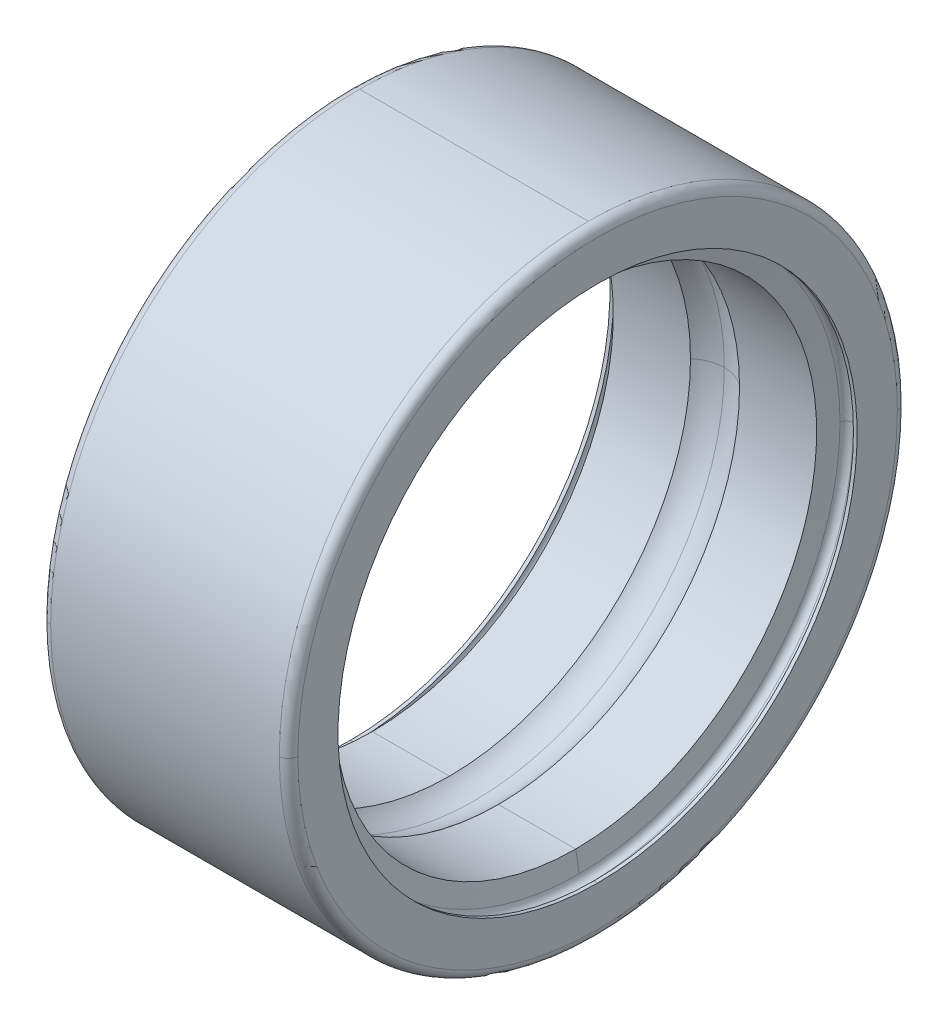
ISO-10303-21;
HEADER;
FILE_DESCRIPTION(('STEP AP214'),'2;1');
FILE_NAME('part.step','',(''),(''),'','','');
FILE_SCHEMA(('AUTOMOTIVE_DESIGN { 1 0 10303 214 1 1 1 1 }'));
ENDSEC;
DATA;
#1=APPLICATION_CONTEXT('core data for automotive mechanical design processes');
#2=APPLICATION_PROTOCOL_DEFINITION('international standard','automotive_design',2000,#1);
#3=PRODUCT_CONTEXT('',#1,'mechanical');
#4=PRODUCT('Part','Part','',(#3));
#5=PRODUCT_RELATED_PRODUCT_CATEGORY('part','',(#4));
#6=PRODUCT_DEFINITION_FORMATION('','',#4);
#7=PRODUCT_DEFINITION_CONTEXT('part definition',#1,'design');
#8=PRODUCT_DEFINITION('design','',#6,#7);
#9=PRODUCT_DEFINITION_SHAPE('','',#8);
#10=(LENGTH_UNIT() NAMED_UNIT(*) SI_UNIT(.MILLI.,.METRE.));
#11=(NAMED_UNIT(*) PLANE_ANGLE_UNIT() SI_UNIT($,.RADIAN.));
#12=(NAMED_UNIT(*) SI_UNIT($,.STERADIAN.) SOLID_ANGLE_UNIT());
#13=UNCERTAINTY_MEASURE_WITH_UNIT(LENGTH_MEASURE(1.E-05),#10,'distance_accuracy_value','');
#14=(GEOMETRIC_REPRESENTATION_CONTEXT(3) GLOBAL_UNCERTAINTY_ASSIGNED_CONTEXT((#13)) GLOBAL_UNIT_ASSIGNED_CONTEXT((#10,
#11,#12)) REPRESENTATION_CONTEXT('',''));
#15=CARTESIAN_POINT('',(0.,0.,0.));
#16=DIRECTION('',(0.,0.,1.));
#17=DIRECTION('',(1.,0.,0.));
#18=AXIS2_PLACEMENT_3D('',#15,#16,#17);
#19=CARTESIAN_POINT('',(3.82,0.,0.));
#20=DIRECTION('',(1.,0.,0.));
#21=DIRECTION('',(0.,0.,-1.));
#22=AXIS2_PLACEMENT_3D('',#19,#20,#21);
#23=TOROIDAL_SURFACE('',#22,4.2,0.12);
#24=CARTESIAN_POINT('',(3.82,0.,0.));
#25=DIRECTION('',(1.,0.,0.));
#26=DIRECTION('',(0.,0.,1.));
#27=AXIS2_PLACEMENT_3D('',#24,#25,#26);
#28=CIRCLE('',#27,4.32);
#29=CARTESIAN_POINT('',(3.82,0.,-4.32));
#30=VERTEX_POINT('',#29);
#31=CARTESIAN_POINT('',(3.82,0.,4.32));
#32=VERTEX_POINT('',#31);
#33=EDGE_CURVE('E184',#30,#32,#28,.T.);
#34=ORIENTED_EDGE('',*,*,#33,.T.);
#35=CARTESIAN_POINT('',(3.82,0.,4.2));
#36=DIRECTION('',(0.,-1.,0.));
#37=DIRECTION('',(0.,0.,1.));
#38=AXIS2_PLACEMENT_3D('',#35,#36,#37);
#39=CIRCLE('',#38,0.12);
#40=CARTESIAN_POINT('',(3.70182306963854,0.,4.22083778132003));
#41=VERTEX_POINT('',#40);
#42=EDGE_CURVE('E197',#32,#41,#39,.T.);
#43=ORIENTED_EDGE('',*,*,#42,.T.);
#44=CARTESIAN_POINT('',(3.70182306963853,0.,0.));
#45=DIRECTION('',(1.,0.,0.));
#46=DIRECTION('',(0.,1.,0.));
#47=AXIS2_PLACEMENT_3D('',#44,#45,#46);
#48=CIRCLE('',#47,4.22083778132003);
#49=CARTESIAN_POINT('',(3.70182306963853,4.22083778132003,0.));
#50=VERTEX_POINT('',#49);
#51=EDGE_CURVE('E31',#50,#41,#48,.T.);
#52=ORIENTED_EDGE('',*,*,#51,.F.);
#53=CARTESIAN_POINT('',(3.70182306963853,0.,0.));
#54=DIRECTION('',(1.,0.,0.));
#55=DIRECTION('',(0.,1.,0.));
#56=AXIS2_PLACEMENT_3D('',#53,#54,#55);
#57=CIRCLE('',#56,4.22083778132003);
#58=CARTESIAN_POINT('',(3.70182306963854,0.,-4.22083778132003));
#59=VERTEX_POINT('',#58);
#60=EDGE_CURVE('E185',#59,#50,#57,.T.);
#61=ORIENTED_EDGE('',*,*,#60,.F.);
#62=CARTESIAN_POINT('',(3.82,0.,-4.2));
#63=DIRECTION('',(0.,-1.,0.));
#64=DIRECTION('',(0.,0.,-1.));
#65=AXIS2_PLACEMENT_3D('',#62,#63,#64);
#66=CIRCLE('',#65,0.12);
#67=EDGE_CURVE('E181',#59,#30,#66,.T.);
#68=ORIENTED_EDGE('',*,*,#67,.T.);
#69=EDGE_LOOP('',(#34,#43,#52,#61,#68));
#70=FACE_BOUND('',#69,.T.);
#71=ADVANCED_FACE('F16',(#70),#23,.F.);
#72=CARTESIAN_POINT('',(3.97,0.,0.));
#73=DIRECTION('',(1.,0.,0.));
#74=DIRECTION('',(0.,1.,0.));
#75=AXIS2_PLACEMENT_3D('',#72,#73,#74);
#76=CYLINDRICAL_SURFACE('',#75,4.2);
#77=DIRECTION('',(1.,0.,0.));
#78=VECTOR('',#77,1.);
#79=CARTESIAN_POINT('',(3.97,4.2,0.));
#80=LINE('',#79,#78);
#81=CARTESIAN_POINT('',(3.94,4.2,0.));
#82=VERTEX_POINT('',#81);
#83=CARTESIAN_POINT('',(4.,4.2,0.));
#84=VERTEX_POINT('',#83);
#85=EDGE_CURVE('E285',#82,#84,#80,.T.);
#86=ORIENTED_EDGE('',*,*,#85,.T.);
#87=CARTESIAN_POINT('',(4.,0.,0.));
#88=DIRECTION('',(1.,0.,0.));
#89=DIRECTION('',(0.,1.,0.));
#90=AXIS2_PLACEMENT_3D('',#87,#88,#89);
#91=CIRCLE('',#90,4.2);
#92=CARTESIAN_POINT('',(4.,-4.2,0.));
#93=VERTEX_POINT('',#92);
#94=EDGE_CURVE('E11',#84,#93,#91,.T.);
#95=ORIENTED_EDGE('',*,*,#94,.T.);
#96=DIRECTION('',(-1.,0.,0.));
#97=VECTOR('',#96,1.);
#98=CARTESIAN_POINT('',(3.97,-4.2,0.));
#99=LINE('',#98,#97);
#100=CARTESIAN_POINT('',(3.94,-4.2,0.));
#101=VERTEX_POINT('',#100);
#102=EDGE_CURVE('E288',#93,#101,#99,.T.);
#103=ORIENTED_EDGE('',*,*,#102,.T.);
#104=CARTESIAN_POINT('',(3.94,0.,0.));
#105=DIRECTION('',(1.,0.,0.));
#106=DIRECTION('',(0.,1.,0.));
#107=AXIS2_PLACEMENT_3D('',#104,#105,#106);
#108=CIRCLE('',#107,4.2);
#109=CARTESIAN_POINT('',(3.94,0.,4.2));
#110=VERTEX_POINT('',#109);
#111=EDGE_CURVE('E201',#110,#101,#108,.T.);
#112=ORIENTED_EDGE('',*,*,#111,.F.);
#113=CARTESIAN_POINT('',(3.94,0.,0.));
#114=DIRECTION('',(1.,0.,0.));
#115=DIRECTION('',(0.,1.,0.));
#116=AXIS2_PLACEMENT_3D('',#113,#114,#115);
#117=CIRCLE('',#116,4.2);
#118=EDGE_CURVE('E236',#82,#110,#117,.T.);
#119=ORIENTED_EDGE('',*,*,#118,.F.);
#120=EDGE_LOOP('',(#86,#95,#103,#112,#119));
#121=FACE_BOUND('',#120,.T.);
#122=ADVANCED_FACE('F18',(#121),#76,.F.);
#123=CARTESIAN_POINT('',(4.,4.525,0.));
#124=DIRECTION('',(1.,0.,0.));
#125=DIRECTION('',(0.,1.,0.));
#126=AXIS2_PLACEMENT_3D('',#123,#124,#125);
#127=PLANE('',#126);
#128=ORIENTED_EDGE('',*,*,#94,.F.);
#129=CARTESIAN_POINT('',(4.,0.,0.));
#130=DIRECTION('',(1.,0.,0.));
#131=DIRECTION('',(0.,1.,0.));
#132=AXIS2_PLACEMENT_3D('',#129,#130,#131);
#133=CIRCLE('',#132,4.2);
#134=EDGE_CURVE('E268',#93,#84,#133,.T.);
#135=ORIENTED_EDGE('',*,*,#134,.F.);
#136=EDGE_LOOP('',(#128,#135));
#137=FACE_BOUND('',#136,.T.);
#138=CARTESIAN_POINT('',(4.,0.,0.));
#139=DIRECTION('',(1.,0.,0.));
#140=DIRECTION('',(0.,1.,0.));
#141=AXIS2_PLACEMENT_3D('',#138,#139,#140);
#142=CIRCLE('',#141,4.85);
#143=CARTESIAN_POINT('',(4.,0.,4.85));
#144=VERTEX_POINT('',#143);
#145=CARTESIAN_POINT('',(4.,0.,-4.85));
#146=VERTEX_POINT('',#145);
#147=EDGE_CURVE('E24',#144,#146,#142,.T.);
#148=ORIENTED_EDGE('',*,*,#147,.T.);
#149=CARTESIAN_POINT('',(4.,0.,0.));
#150=DIRECTION('',(1.,0.,0.));
#151=DIRECTION('',(0.,1.,0.));
#152=AXIS2_PLACEMENT_3D('',#149,#150,#151);
#153=CIRCLE('',#152,4.85);
#154=EDGE_CURVE('E331',#146,#144,#153,.T.);
#155=ORIENTED_EDGE('',*,*,#154,.T.);
#156=EDGE_LOOP('',(#148,#155));
#157=FACE_BOUND('',#156,.T.);
#158=ADVANCED_FACE('F414',(#137,#157),#127,.T.);
#159=CARTESIAN_POINT('',(3.85,0.,0.));
#160=DIRECTION('',(1.,0.,0.));
#161=DIRECTION('',(0.,0.,-1.));
#162=AXIS2_PLACEMENT_3D('',#159,#160,#161);
#163=TOROIDAL_SURFACE('',#162,4.85,0.15);
#164=CARTESIAN_POINT('',(3.85,0.,-4.85));
#165=DIRECTION('',(0.,-1.,0.));
#166=DIRECTION('',(0.,0.,-1.));
#167=AXIS2_PLACEMENT_3D('',#164,#165,#166);
#168=CIRCLE('',#167,0.15);
#169=CARTESIAN_POINT('',(3.85,0.,-5.));
#170=VERTEX_POINT('',#169);
#171=EDGE_CURVE('E264',#170,#146,#168,.T.);
#172=ORIENTED_EDGE('',*,*,#171,.T.);
#173=ORIENTED_EDGE('',*,*,#147,.F.);
#174=CARTESIAN_POINT('',(3.85,0.,4.85));
#175=DIRECTION('',(0.,-1.,0.));
#176=DIRECTION('',(0.,0.,1.));
#177=AXIS2_PLACEMENT_3D('',#174,#175,#176);
#178=CIRCLE('',#177,0.15);
#179=CARTESIAN_POINT('',(3.85,0.,5.));
#180=VERTEX_POINT('',#179);
#181=EDGE_CURVE('E328',#144,#180,#178,.T.);
#182=ORIENTED_EDGE('',*,*,#181,.T.);
#183=CARTESIAN_POINT('',(3.85,0.,0.));
#184=DIRECTION('',(1.,0.,0.));
#185=DIRECTION('',(0.,1.,0.));
#186=AXIS2_PLACEMENT_3D('',#183,#184,#185);
#187=CIRCLE('',#186,5.);
#188=CARTESIAN_POINT('',(3.85,-5.,0.));
#189=VERTEX_POINT('',#188);
#190=EDGE_CURVE('E226',#180,#189,#187,.T.);
#191=ORIENTED_EDGE('',*,*,#190,.T.);
#192=CARTESIAN_POINT('',(3.85,0.,0.));
#193=DIRECTION('',(1.,0.,0.));
#194=DIRECTION('',(0.,1.,0.));
#195=AXIS2_PLACEMENT_3D('',#192,#193,#194);
#196=CIRCLE('',#195,5.);
#197=EDGE_CURVE('E257',#189,#170,#196,.T.);
#198=ORIENTED_EDGE('',*,*,#197,.T.);
#199=EDGE_LOOP('',(#172,#173,#182,#191,#198));
#200=FACE_BOUND('',#199,.T.);
#201=ADVANCED_FACE('F402',(#200),#163,.T.);
#202=CARTESIAN_POINT('',(2.,0.,0.));
#203=DIRECTION('',(1.,0.,0.));
#204=DIRECTION('',(0.,1.,0.));
#205=AXIS2_PLACEMENT_3D('',#202,#203,#204);
#206=CYLINDRICAL_SURFACE('',#205,5.);
#207=DIRECTION('',(1.,0.,0.));
#208=VECTOR('',#207,1.);
#209=CARTESIAN_POINT('',(2.,5.,0.));
#210=LINE('',#209,#208);
#211=CARTESIAN_POINT('',(0.15,5.,0.));
#212=VERTEX_POINT('',#211);
#213=CARTESIAN_POINT('',(3.85,5.,0.));
#214=VERTEX_POINT('',#213);
#215=EDGE_CURVE('E242',#212,#214,#210,.T.);
#216=ORIENTED_EDGE('',*,*,#215,.T.);
#217=CARTESIAN_POINT('',(3.85,0.,0.));
#218=DIRECTION('',(1.,0.,0.));
#219=DIRECTION('',(0.,1.,0.));
#220=AXIS2_PLACEMENT_3D('',#217,#218,#219);
#221=CIRCLE('',#220,5.);
#222=EDGE_CURVE('E267',#170,#214,#221,.T.);
#223=ORIENTED_EDGE('',*,*,#222,.F.);
#224=ORIENTED_EDGE('',*,*,#197,.F.);
#225=DIRECTION('',(-1.,0.,0.));
#226=VECTOR('',#225,1.);
#227=CARTESIAN_POINT('',(2.,-5.,0.));
#228=LINE('',#227,#226);
#229=CARTESIAN_POINT('',(0.15,-5.,0.));
#230=VERTEX_POINT('',#229);
#231=EDGE_CURVE('E224',#189,#230,#228,.T.);
#232=ORIENTED_EDGE('',*,*,#231,.T.);
#233=CARTESIAN_POINT('',(0.15,0.,0.));
#234=DIRECTION('',(1.,0.,0.));
#235=DIRECTION('',(0.,1.,0.));
#236=AXIS2_PLACEMENT_3D('',#233,#234,#235);
#237=CIRCLE('',#236,5.);
#238=CARTESIAN_POINT('',(0.15,0.,-5.));
#239=VERTEX_POINT('',#238);
#240=EDGE_CURVE('E362',#230,#239,#237,.T.);
#241=ORIENTED_EDGE('',*,*,#240,.T.);
#242=CARTESIAN_POINT('',(0.15,0.,0.));
#243=DIRECTION('',(1.,0.,0.));
#244=DIRECTION('',(0.,1.,0.));
#245=AXIS2_PLACEMENT_3D('',#242,#243,#244);
#246=CIRCLE('',#245,5.);
#247=EDGE_CURVE('E351',#239,#212,#246,.T.);
#248=ORIENTED_EDGE('',*,*,#247,.T.);
#249=EDGE_LOOP('',(#216,#223,#224,#232,#241,#248));
#250=FACE_BOUND('',#249,.T.);
#251=ADVANCED_FACE('F406',(#250),#206,.T.);
#252=CARTESIAN_POINT('',(0.15,0.,0.));
#253=DIRECTION('',(1.,0.,0.));
#254=DIRECTION('',(0.,0.,-1.));
#255=AXIS2_PLACEMENT_3D('',#252,#253,#254);
#256=TOROIDAL_SURFACE('',#255,4.85,0.15);
#257=CARTESIAN_POINT('',(0.15,0.,-4.85));
#258=DIRECTION('',(0.,-1.,0.));
#259=DIRECTION('',(0.,0.,-1.));
#260=AXIS2_PLACEMENT_3D('',#257,#258,#259);
#261=CIRCLE('',#260,0.15);
#262=CARTESIAN_POINT('',(0.,0.,-4.85));
#263=VERTEX_POINT('',#262);
#264=EDGE_CURVE('E337',#263,#239,#261,.T.);
#265=ORIENTED_EDGE('',*,*,#264,.T.);
#266=ORIENTED_EDGE('',*,*,#240,.F.);
#267=CARTESIAN_POINT('',(0.15,0.,0.));
#268=DIRECTION('',(1.,0.,0.));
#269=DIRECTION('',(0.,1.,0.));
#270=AXIS2_PLACEMENT_3D('',#267,#268,#269);
#271=CIRCLE('',#270,5.);
#272=CARTESIAN_POINT('',(0.15,0.,5.));
#273=VERTEX_POINT('',#272);
#274=EDGE_CURVE('E227',#273,#230,#271,.T.);
#275=ORIENTED_EDGE('',*,*,#274,.F.);
#276=CARTESIAN_POINT('',(0.15,0.,4.85));
#277=DIRECTION('',(0.,-1.,0.));
#278=DIRECTION('',(0.,0.,1.));
#279=AXIS2_PLACEMENT_3D('',#276,#277,#278);
#280=CIRCLE('',#279,0.15);
#281=CARTESIAN_POINT('',(0.,0.,4.85));
#282=VERTEX_POINT('',#281);
#283=EDGE_CURVE('E348',#273,#282,#280,.T.);
#284=ORIENTED_EDGE('',*,*,#283,.T.);
#285=CARTESIAN_POINT('',(0.,0.,0.));
#286=DIRECTION('',(1.,0.,0.));
#287=DIRECTION('',(0.,1.,0.));
#288=AXIS2_PLACEMENT_3D('',#285,#286,#287);
#289=CIRCLE('',#288,4.85);
#290=EDGE_CURVE('E357',#282,#263,#289,.T.);
#291=ORIENTED_EDGE('',*,*,#290,.T.);
#292=EDGE_LOOP('',(#265,#266,#275,#284,#291));
#293=FACE_BOUND('',#292,.T.);
#294=ADVANCED_FACE('F424',(#293),#256,.T.);
#295=CARTESIAN_POINT('',(0.,4.525,0.));
#296=DIRECTION('',(-1.,0.,0.));
#297=DIRECTION('',(0.,0.,1.));
#298=AXIS2_PLACEMENT_3D('',#295,#296,#297);
#299=PLANE('',#298);
#300=CARTESIAN_POINT('',(0.,0.,0.));
#301=DIRECTION('',(1.,0.,0.));
#302=DIRECTION('',(0.,1.,0.));
#303=AXIS2_PLACEMENT_3D('',#300,#301,#302);
#304=CIRCLE('',#303,4.2);
#305=CARTESIAN_POINT('',(0.,4.2,0.));
#306=VERTEX_POINT('',#305);
#307=CARTESIAN_POINT('',(0.,-4.2,0.));
#308=VERTEX_POINT('',#307);
#309=EDGE_CURVE('E353',#306,#308,#304,.T.);
#310=ORIENTED_EDGE('',*,*,#309,.T.);
#311=CARTESIAN_POINT('',(0.,0.,0.));
#312=DIRECTION('',(1.,0.,0.));
#313=DIRECTION('',(0.,1.,0.));
#314=AXIS2_PLACEMENT_3D('',#311,#312,#313);
#315=CIRCLE('',#314,4.2);
#316=EDGE_CURVE('E360',#308,#306,#315,.T.);
#317=ORIENTED_EDGE('',*,*,#316,.T.);
#318=EDGE_LOOP('',(#310,#317));
#319=FACE_BOUND('',#318,.T.);
#320=CARTESIAN_POINT('',(0.,0.,0.));
#321=DIRECTION('',(1.,0.,0.));
#322=DIRECTION('',(0.,1.,0.));
#323=AXIS2_PLACEMENT_3D('',#320,#321,#322);
#324=CIRCLE('',#323,4.85);
#325=EDGE_CURVE('E343',#263,#282,#324,.T.);
#326=ORIENTED_EDGE('',*,*,#325,.F.);
#327=ORIENTED_EDGE('',*,*,#290,.F.);
#328=EDGE_LOOP('',(#326,#327));
#329=FACE_BOUND('',#328,.T.);
#330=ADVANCED_FACE('F427',(#319,#329),#299,.T.);
#331=CARTESIAN_POINT('',(0.03,0.,0.));
#332=DIRECTION('',(1.,0.,0.));
#333=DIRECTION('',(0.,1.,0.));
#334=AXIS2_PLACEMENT_3D('',#331,#332,#333);
#335=CYLINDRICAL_SURFACE('',#334,4.2);
#336=DIRECTION('',(1.,0.,0.));
#337=VECTOR('',#336,1.);
#338=CARTESIAN_POINT('',(0.03,4.2,0.));
#339=LINE('',#338,#337);
#340=CARTESIAN_POINT('',(0.06,4.2,0.));
#341=VERTEX_POINT('',#340);
#342=EDGE_CURVE('E355',#306,#341,#339,.T.);
#343=ORIENTED_EDGE('',*,*,#342,.T.);
#344=CARTESIAN_POINT('',(0.06,0.,0.));
#345=DIRECTION('',(1.,0.,0.));
#346=DIRECTION('',(0.,1.,0.));
#347=AXIS2_PLACEMENT_3D('',#344,#345,#346);
#348=CIRCLE('',#347,4.2);
#349=CARTESIAN_POINT('',(0.06,0.,4.2));
#350=VERTEX_POINT('',#349);
#351=EDGE_CURVE('E345',#341,#350,#348,.T.);
#352=ORIENTED_EDGE('',*,*,#351,.T.);
#353=CARTESIAN_POINT('',(0.06,0.,0.));
#354=DIRECTION('',(1.,0.,0.));
#355=DIRECTION('',(0.,1.,0.));
#356=AXIS2_PLACEMENT_3D('',#353,#354,#355);
#357=CIRCLE('',#356,4.2);
#358=CARTESIAN_POINT('',(0.06,-4.2,0.));
#359=VERTEX_POINT('',#358);
#360=EDGE_CURVE('E291',#350,#359,#357,.T.);
#361=ORIENTED_EDGE('',*,*,#360,.T.);
#362=DIRECTION('',(-1.,0.,0.));
#363=VECTOR('',#362,1.);
#364=CARTESIAN_POINT('',(0.03,-4.2,0.));
#365=LINE('',#364,#363);
#366=EDGE_CURVE('E365',#359,#308,#365,.T.);
#367=ORIENTED_EDGE('',*,*,#366,.T.);
#368=ORIENTED_EDGE('',*,*,#309,.F.);
#369=EDGE_LOOP('',(#343,#352,#361,#367,#368));
#370=FACE_BOUND('',#369,.T.);
#371=ADVANCED_FACE('F429',(#370),#335,.F.);
#372=CARTESIAN_POINT('',(0.18,0.,0.));
#373=DIRECTION('',(1.,0.,0.));
#374=DIRECTION('',(0.,0.,-1.));
#375=AXIS2_PLACEMENT_3D('',#372,#373,#374);
#376=TOROIDAL_SURFACE('',#375,4.2,0.12);
#377=CARTESIAN_POINT('',(0.18,0.,0.));
#378=DIRECTION('',(1.,0.,0.));
#379=DIRECTION('',(0.,0.,1.));
#380=AXIS2_PLACEMENT_3D('',#377,#378,#379);
#381=CIRCLE('',#380,4.32);
#382=CARTESIAN_POINT('',(0.18,0.,-4.32));
#383=VERTEX_POINT('',#382);
#384=CARTESIAN_POINT('',(0.18,0.,4.32));
#385=VERTEX_POINT('',#384);
#386=EDGE_CURVE('E255',#383,#385,#381,.T.);
#387=ORIENTED_EDGE('',*,*,#386,.T.);
#388=CARTESIAN_POINT('',(0.18,0.,4.2));
#389=DIRECTION('',(0.,-1.,0.));
#390=DIRECTION('',(0.,0.,1.));
#391=AXIS2_PLACEMENT_3D('',#388,#389,#390);
#392=CIRCLE('',#391,0.12);
#393=EDGE_CURVE('E293',#385,#350,#392,.T.);
#394=ORIENTED_EDGE('',*,*,#393,.T.);
#395=ORIENTED_EDGE('',*,*,#351,.F.);
#396=CARTESIAN_POINT('',(0.06,0.,0.));
#397=DIRECTION('',(1.,0.,0.));
#398=DIRECTION('',(0.,1.,0.));
#399=AXIS2_PLACEMENT_3D('',#396,#397,#398);
#400=CIRCLE('',#399,4.2);
#401=CARTESIAN_POINT('',(0.06,0.,-4.2));
#402=VERTEX_POINT('',#401);
#403=EDGE_CURVE('E371',#402,#341,#400,.T.);
#404=ORIENTED_EDGE('',*,*,#403,.F.);
#405=CARTESIAN_POINT('',(0.18,0.,-4.2));
#406=DIRECTION('',(0.,-1.,0.));
#407=DIRECTION('',(0.,0.,-1.));
#408=AXIS2_PLACEMENT_3D('',#405,#406,#407);
#409=CIRCLE('',#408,0.12);
#410=EDGE_CURVE('E294',#402,#383,#409,.T.);
#411=ORIENTED_EDGE('',*,*,#410,.T.);
#412=EDGE_LOOP('',(#387,#394,#395,#404,#411));
#413=FACE_BOUND('',#412,.T.);
#414=ADVANCED_FACE('F437',(#413),#376,.F.);
#415=CARTESIAN_POINT('',(0.326463109000147,0.,0.));
#416=DIRECTION('',(-1.,0.,0.));
#417=DIRECTION('',(0.,1.,0.));
#418=AXIS2_PLACEMENT_3D('',#415,#416,#417);
#419=CONICAL_SURFACE('',#418,4.06041889066002,1.39626340159546);
#420=DIRECTION('',(0.173648177666931,-0.984807753012208,0.));
#421=VECTOR('',#420,1.);
#422=CARTESIAN_POINT('',(0.326463109000147,4.06041889066002,0.));
#423=LINE('',#422,#421);
#424=CARTESIAN_POINT('',(0.298176930361465,4.22083778132003,0.));
#425=VERTEX_POINT('',#424);
#426=CARTESIAN_POINT('',(0.354749287638829,3.9,0.));
#427=VERTEX_POINT('',#426);
#428=EDGE_CURVE('E298',#425,#427,#423,.T.);
#429=ORIENTED_EDGE('',*,*,#428,.T.);
#430=CARTESIAN_POINT('',(0.354749287638829,0.,0.));
#431=DIRECTION('',(1.,0.,0.));
#432=DIRECTION('',(0.,1.,0.));
#433=AXIS2_PLACEMENT_3D('',#430,#431,#432);
#434=CIRCLE('',#433,3.9);
#435=CARTESIAN_POINT('',(0.354749287638829,-3.9,0.));
#436=VERTEX_POINT('',#435);
#437=EDGE_CURVE('E340',#427,#436,#434,.T.);
#438=ORIENTED_EDGE('',*,*,#437,.T.);
#439=DIRECTION('',(-0.173648177666931,-0.984807753012208,0.));
#440=VECTOR('',#439,1.);
#441=CARTESIAN_POINT('',(0.326463109000147,-4.06041889066002,0.));
#442=LINE('',#441,#440);
#443=CARTESIAN_POINT('',(0.298176930361465,-4.22083778132003,0.));
#444=VERTEX_POINT('',#443);
#445=EDGE_CURVE('E248',#436,#444,#442,.T.);
#446=ORIENTED_EDGE('',*,*,#445,.T.);
#447=CARTESIAN_POINT('',(0.298176930361465,0.,0.));
#448=DIRECTION('',(1.,0.,0.));
#449=DIRECTION('',(0.,1.,0.));
#450=AXIS2_PLACEMENT_3D('',#447,#448,#449);
#451=CIRCLE('',#450,4.22083778132003);
#452=CARTESIAN_POINT('',(0.298176930361465,0.,4.22083778132003));
#453=VERTEX_POINT('',#452);
#454=EDGE_CURVE('E309',#453,#444,#451,.T.);
#455=ORIENTED_EDGE('',*,*,#454,.F.);
#456=CARTESIAN_POINT('',(0.298176930361465,0.,0.));
#457=DIRECTION('',(1.,0.,0.));
#458=DIRECTION('',(0.,1.,0.));
#459=AXIS2_PLACEMENT_3D('',#456,#457,#458);
#460=CIRCLE('',#459,4.22083778132003);
#461=EDGE_CURVE('E271',#425,#453,#460,.T.);
#462=ORIENTED_EDGE('',*,*,#461,.F.);
#463=EDGE_LOOP('',(#429,#438,#446,#455,#462));
#464=FACE_BOUND('',#463,.T.);
#465=ADVANCED_FACE('F523',(#464),#419,.F.);
#466=CARTESIAN_POINT('',(0.97894329548957,0.,0.));
#467=DIRECTION('',(1.,0.,0.));
#468=DIRECTION('',(0.,1.,0.));
#469=AXIS2_PLACEMENT_3D('',#466,#467,#468);
#470=CYLINDRICAL_SURFACE('',#469,3.9);
#471=DIRECTION('',(1.,0.,0.));
#472=VECTOR('',#471,1.);
#473=CARTESIAN_POINT('',(0.97894329548957,3.9,0.));
#474=LINE('',#473,#472);
#475=CARTESIAN_POINT('',(1.60313730334031,3.9,0.));
#476=VERTEX_POINT('',#475);
#477=EDGE_CURVE('E247',#427,#476,#474,.T.);
#478=ORIENTED_EDGE('',*,*,#477,.T.);
#479=CARTESIAN_POINT('',(1.60313730334031,0.,0.));
#480=DIRECTION('',(1.,0.,0.));
#481=DIRECTION('',(0.,1.,0.));
#482=AXIS2_PLACEMENT_3D('',#479,#480,#481);
#483=CIRCLE('',#482,3.9);
#484=CARTESIAN_POINT('',(1.60313730334031,0.,3.9));
#485=VERTEX_POINT('',#484);
#486=EDGE_CURVE('E338',#476,#485,#483,.T.);
#487=ORIENTED_EDGE('',*,*,#486,.T.);
#488=CARTESIAN_POINT('',(1.60313730334031,0.,0.));
#489=DIRECTION('',(1.,0.,0.));
#490=DIRECTION('',(0.,1.,0.));
#491=AXIS2_PLACEMENT_3D('',#488,#489,#490);
#492=CIRCLE('',#491,3.9);
#493=CARTESIAN_POINT('',(1.60313730334031,-3.9,0.));
#494=VERTEX_POINT('',#493);
#495=EDGE_CURVE('E274',#485,#494,#492,.T.);
#496=ORIENTED_EDGE('',*,*,#495,.T.);
#497=DIRECTION('',(-1.,0.,0.));
#498=VECTOR('',#497,1.);
#499=CARTESIAN_POINT('',(0.97894329548957,-3.9,0.));
#500=LINE('',#499,#498);
#501=EDGE_CURVE('E284',#494,#436,#500,.T.);
#502=ORIENTED_EDGE('',*,*,#501,.T.);
#503=ORIENTED_EDGE('',*,*,#437,.F.);
#504=EDGE_LOOP('',(#478,#487,#496,#502,#503));
#505=FACE_BOUND('',#504,.T.);
#506=ADVANCED_FACE('F481',(#505),#470,.F.);
#507=CARTESIAN_POINT('',(2.,0.,0.));
#508=DIRECTION('',(1.,0.,0.));
#509=DIRECTION('',(0.,0.,-1.));
#510=AXIS2_PLACEMENT_3D('',#507,#508,#509);
#511=TOROIDAL_SURFACE('',#510,3.45,0.6);
#512=CARTESIAN_POINT('',(2.,0.,0.));
#513=DIRECTION('',(1.,0.,0.));
#514=DIRECTION('',(0.,0.,1.));
#515=AXIS2_PLACEMENT_3D('',#512,#513,#514);
#516=CIRCLE('',#515,4.05);
#517=CARTESIAN_POINT('',(2.,0.,-4.05));
#518=VERTEX_POINT('',#517);
#519=CARTESIAN_POINT('',(2.,0.,4.05));
#520=VERTEX_POINT('',#519);
#521=EDGE_CURVE('E253',#518,#520,#516,.T.);
#522=ORIENTED_EDGE('',*,*,#521,.T.);
#523=CARTESIAN_POINT('',(2.,0.,3.45));
#524=DIRECTION('',(0.,-1.,0.));
#525=DIRECTION('',(0.,0.,1.));
#526=AXIS2_PLACEMENT_3D('',#523,#524,#525);
#527=CIRCLE('',#526,0.6);
#528=EDGE_CURVE('E382',#520,#485,#527,.T.);
#529=ORIENTED_EDGE('',*,*,#528,.T.);
#530=ORIENTED_EDGE('',*,*,#486,.F.);
#531=CARTESIAN_POINT('',(1.60313730334031,0.,0.));
#532=DIRECTION('',(1.,0.,0.));
#533=DIRECTION('',(0.,1.,0.));
#534=AXIS2_PLACEMENT_3D('',#531,#532,#533);
#535=CIRCLE('',#534,3.9);
#536=CARTESIAN_POINT('',(1.60313730334031,0.,-3.9));
#537=VERTEX_POINT('',#536);
#538=EDGE_CURVE('E275',#537,#476,#535,.T.);
#539=ORIENTED_EDGE('',*,*,#538,.F.);
#540=CARTESIAN_POINT('',(2.,0.,-3.45));
#541=DIRECTION('',(0.,-1.,0.));
#542=DIRECTION('',(0.,0.,-1.));
#543=AXIS2_PLACEMENT_3D('',#540,#541,#542);
#544=CIRCLE('',#543,0.6);
#545=EDGE_CURVE('E272',#537,#518,#544,.T.);
#546=ORIENTED_EDGE('',*,*,#545,.T.);
#547=EDGE_LOOP('',(#522,#529,#530,#539,#546));
#548=FACE_BOUND('',#547,.T.);
#549=ADVANCED_FACE('F477',(#548),#511,.F.);
#550=CARTESIAN_POINT('',(3.02105670451043,0.,0.));
#551=DIRECTION('',(1.,0.,0.));
#552=DIRECTION('',(0.,1.,0.));
#553=AXIS2_PLACEMENT_3D('',#550,#551,#552);
#554=CYLINDRICAL_SURFACE('',#553,3.9);
#555=DIRECTION('',(1.,0.,0.));
#556=VECTOR('',#555,1.);
#557=CARTESIAN_POINT('',(3.02105670451043,3.9,0.));
#558=LINE('',#557,#556);
#559=CARTESIAN_POINT('',(2.39686269665969,3.9,0.));
#560=VERTEX_POINT('',#559);
#561=CARTESIAN_POINT('',(3.64525071236117,3.9,0.));
#562=VERTEX_POINT('',#561);
#563=EDGE_CURVE('E385',#560,#562,#558,.T.);
#564=ORIENTED_EDGE('',*,*,#563,.T.);
#565=CARTESIAN_POINT('',(3.64525071236117,0.,0.));
#566=DIRECTION('',(1.,0.,0.));
#567=DIRECTION('',(0.,1.,0.));
#568=AXIS2_PLACEMENT_3D('',#565,#566,#567);
#569=CIRCLE('',#568,3.9);
#570=CARTESIAN_POINT('',(3.64525071236117,-3.9,0.));
#571=VERTEX_POINT('',#570);
#572=EDGE_CURVE('E39',#562,#571,#569,.T.);
#573=ORIENTED_EDGE('',*,*,#572,.T.);
#574=DIRECTION('',(-1.,0.,0.));
#575=VECTOR('',#574,1.);
#576=CARTESIAN_POINT('',(3.02105670451043,-3.9,0.));
#577=LINE('',#576,#575);
#578=CARTESIAN_POINT('',(2.39686269665969,-3.9,0.));
#579=VERTEX_POINT('',#578);
#580=EDGE_CURVE('E387',#571,#579,#577,.T.);
#581=ORIENTED_EDGE('',*,*,#580,.T.);
#582=CARTESIAN_POINT('',(2.39686269665969,0.,0.));
#583=DIRECTION('',(1.,0.,0.));
#584=DIRECTION('',(0.,1.,0.));
#585=AXIS2_PLACEMENT_3D('',#582,#583,#584);
#586=CIRCLE('',#585,3.9);
#587=CARTESIAN_POINT('',(2.39686269665969,0.,3.9));
#588=VERTEX_POINT('',#587);
#589=EDGE_CURVE('E297',#588,#579,#586,.T.);
#590=ORIENTED_EDGE('',*,*,#589,.F.);
#591=CARTESIAN_POINT('',(2.39686269665969,0.,0.));
#592=DIRECTION('',(1.,0.,0.));
#593=DIRECTION('',(0.,1.,0.));
#594=AXIS2_PLACEMENT_3D('',#591,#592,#593);
#595=CIRCLE('',#594,3.9);
#596=EDGE_CURVE('E222',#560,#588,#595,.T.);
#597=ORIENTED_EDGE('',*,*,#596,.F.);
#598=EDGE_LOOP('',(#564,#573,#581,#590,#597));
#599=FACE_BOUND('',#598,.T.);
#600=ADVANCED_FACE('F480',(#599),#554,.F.);
#601=CARTESIAN_POINT('',(3.67353689099985,0.,0.));
#602=DIRECTION('',(1.,0.,0.));
#603=DIRECTION('',(0.,1.,0.));
#604=AXIS2_PLACEMENT_3D('',#601,#602,#603);
#605=CONICAL_SURFACE('',#604,4.06041889066002,1.39626340159546);
#606=DIRECTION('',(0.173648177666931,0.984807753012208,0.));
#607=VECTOR('',#606,1.);
#608=CARTESIAN_POINT('',(3.67353689099985,4.06041889066002,0.));
#609=LINE('',#608,#607);
#610=EDGE_CURVE('E392',#562,#50,#609,.T.);
#611=ORIENTED_EDGE('',*,*,#610,.T.);
#612=ORIENTED_EDGE('',*,*,#51,.T.);
#613=CARTESIAN_POINT('',(3.70182306963853,0.,0.));
#614=DIRECTION('',(1.,0.,0.));
#615=DIRECTION('',(0.,1.,0.));
#616=AXIS2_PLACEMENT_3D('',#613,#614,#615);
#617=CIRCLE('',#616,4.22083778132003);
#618=CARTESIAN_POINT('',(3.70182306963853,-4.22083778132003,0.));
#619=VERTEX_POINT('',#618);
#620=EDGE_CURVE('E250',#41,#619,#617,.T.);
#621=ORIENTED_EDGE('',*,*,#620,.T.);
#622=DIRECTION('',(-0.173648177666931,0.984807753012208,0.));
#623=VECTOR('',#622,1.);
#624=CARTESIAN_POINT('',(3.67353689099985,-4.06041889066002,0.));
#625=LINE('',#624,#623);
#626=EDGE_CURVE('E395',#619,#571,#625,.T.);
#627=ORIENTED_EDGE('',*,*,#626,.T.);
#628=ORIENTED_EDGE('',*,*,#572,.F.);
#629=EDGE_LOOP('',(#611,#612,#621,#627,#628));
#630=FACE_BOUND('',#629,.T.);
#631=ADVANCED_FACE('F514',(#630),#605,.F.);
#632=CARTESIAN_POINT('',(3.67353689099985,0.,0.));
#633=DIRECTION('',(1.,0.,0.));
#634=DIRECTION('',(0.,1.,0.));
#635=AXIS2_PLACEMENT_3D('',#632,#633,#634);
#636=CONICAL_SURFACE('',#635,4.06041889066002,1.39626340159546);
#637=ORIENTED_EDGE('',*,*,#610,.F.);
#638=CARTESIAN_POINT('',(3.64525071236117,0.,0.));
#639=DIRECTION('',(1.,0.,0.));
#640=DIRECTION('',(0.,1.,0.));
#641=AXIS2_PLACEMENT_3D('',#638,#639,#640);
#642=CIRCLE('',#641,3.9);
#643=EDGE_CURVE('E389',#571,#562,#642,.T.);
#644=ORIENTED_EDGE('',*,*,#643,.F.);
#645=ORIENTED_EDGE('',*,*,#626,.F.);
#646=CARTESIAN_POINT('',(3.70182306963853,0.,0.));
#647=DIRECTION('',(1.,0.,0.));
#648=DIRECTION('',(0.,1.,0.));
#649=AXIS2_PLACEMENT_3D('',#646,#647,#648);
#650=CIRCLE('',#649,4.22083778132003);
#651=EDGE_CURVE('E189',#619,#59,#650,.T.);
#652=ORIENTED_EDGE('',*,*,#651,.T.);
#653=ORIENTED_EDGE('',*,*,#60,.T.);
#654=EDGE_LOOP('',(#637,#644,#645,#652,#653));
#655=FACE_BOUND('',#654,.T.);
#656=ADVANCED_FACE('F510',(#655),#636,.F.);
#657=CARTESIAN_POINT('',(3.02105670451043,0.,0.));
#658=DIRECTION('',(1.,0.,0.));
#659=DIRECTION('',(0.,1.,0.));
#660=AXIS2_PLACEMENT_3D('',#657,#658,#659);
#661=CYLINDRICAL_SURFACE('',#660,3.9);
#662=ORIENTED_EDGE('',*,*,#563,.F.);
#663=CARTESIAN_POINT('',(2.39686269665969,0.,0.));
#664=DIRECTION('',(1.,0.,0.));
#665=DIRECTION('',(0.,1.,0.));
#666=AXIS2_PLACEMENT_3D('',#663,#664,#665);
#667=CIRCLE('',#666,3.9);
#668=CARTESIAN_POINT('',(2.39686269665969,0.,-3.9));
#669=VERTEX_POINT('',#668);
#670=EDGE_CURVE('E219',#669,#560,#667,.T.);
#671=ORIENTED_EDGE('',*,*,#670,.F.);
#672=CARTESIAN_POINT('',(2.39686269665969,0.,0.));
#673=DIRECTION('',(1.,0.,0.));
#674=DIRECTION('',(0.,1.,0.));
#675=AXIS2_PLACEMENT_3D('',#672,#673,#674);
#676=CIRCLE('',#675,3.9);
#677=EDGE_CURVE('E302',#579,#669,#676,.T.);
#678=ORIENTED_EDGE('',*,*,#677,.F.);
#679=ORIENTED_EDGE('',*,*,#580,.F.);
#680=ORIENTED_EDGE('',*,*,#643,.T.);
#681=EDGE_LOOP('',(#662,#671,#678,#679,#680));
#682=FACE_BOUND('',#681,.T.);
#683=ADVANCED_FACE('F499',(#682),#661,.F.);
#684=CARTESIAN_POINT('',(2.,0.,0.));
#685=DIRECTION('',(1.,0.,0.));
#686=DIRECTION('',(0.,0.,-1.));
#687=AXIS2_PLACEMENT_3D('',#684,#685,#686);
#688=TOROIDAL_SURFACE('',#687,3.45,0.6);
#689=CARTESIAN_POINT('',(2.,0.,0.));
#690=DIRECTION('',(1.,0.,0.));
#691=DIRECTION('',(0.,0.,1.));
#692=AXIS2_PLACEMENT_3D('',#689,#690,#691);
#693=CIRCLE('',#692,4.05);
#694=EDGE_CURVE('E239',#520,#518,#693,.T.);
#695=ORIENTED_EDGE('',*,*,#694,.T.);
#696=ORIENTED_EDGE('',*,*,#545,.F.);
#697=CARTESIAN_POINT('',(1.60313730334031,0.,0.));
#698=DIRECTION('',(1.,0.,0.));
#699=DIRECTION('',(0.,1.,0.));
#700=AXIS2_PLACEMENT_3D('',#697,#698,#699);
#701=CIRCLE('',#700,3.9);
#702=EDGE_CURVE('E281',#494,#537,#701,.T.);
#703=ORIENTED_EDGE('',*,*,#702,.F.);
#704=ORIENTED_EDGE('',*,*,#495,.F.);
#705=ORIENTED_EDGE('',*,*,#528,.F.);
#706=EDGE_LOOP('',(#695,#696,#703,#704,#705));
#707=FACE_BOUND('',#706,.T.);
#708=ADVANCED_FACE('F475',(#707),#688,.F.);
#709=CARTESIAN_POINT('',(0.97894329548957,0.,0.));
#710=DIRECTION('',(1.,0.,0.));
#711=DIRECTION('',(0.,1.,0.));
#712=AXIS2_PLACEMENT_3D('',#709,#710,#711);
#713=CYLINDRICAL_SURFACE('',#712,3.9);
#714=ORIENTED_EDGE('',*,*,#477,.F.);
#715=CARTESIAN_POINT('',(0.354749287638829,0.,0.));
#716=DIRECTION('',(1.,0.,0.));
#717=DIRECTION('',(0.,1.,0.));
#718=AXIS2_PLACEMENT_3D('',#715,#716,#717);
#719=CIRCLE('',#718,3.9);
#720=EDGE_CURVE('E244',#436,#427,#719,.T.);
#721=ORIENTED_EDGE('',*,*,#720,.F.);
#722=ORIENTED_EDGE('',*,*,#501,.F.);
#723=ORIENTED_EDGE('',*,*,#702,.T.);
#724=ORIENTED_EDGE('',*,*,#538,.T.);
#725=EDGE_LOOP('',(#714,#721,#722,#723,#724));
#726=FACE_BOUND('',#725,.T.);
#727=ADVANCED_FACE('F471',(#726),#713,.F.);
#728=CARTESIAN_POINT('',(0.326463109000147,0.,0.));
#729=DIRECTION('',(-1.,0.,0.));
#730=DIRECTION('',(0.,1.,0.));
#731=AXIS2_PLACEMENT_3D('',#728,#729,#730);
#732=CONICAL_SURFACE('',#731,4.06041889066002,1.39626340159546);
#733=ORIENTED_EDGE('',*,*,#428,.F.);
#734=CARTESIAN_POINT('',(0.298176930361465,0.,0.));
#735=DIRECTION('',(1.,0.,0.));
#736=DIRECTION('',(0.,1.,0.));
#737=AXIS2_PLACEMENT_3D('',#734,#735,#736);
#738=CIRCLE('',#737,4.22083778132003);
#739=CARTESIAN_POINT('',(0.298176930361465,0.,-4.22083778132003));
#740=VERTEX_POINT('',#739);
#741=EDGE_CURVE('E263',#740,#425,#738,.T.);
#742=ORIENTED_EDGE('',*,*,#741,.F.);
#743=CARTESIAN_POINT('',(0.298176930361465,0.,0.));
#744=DIRECTION('',(1.,0.,0.));
#745=DIRECTION('',(0.,1.,0.));
#746=AXIS2_PLACEMENT_3D('',#743,#744,#745);
#747=CIRCLE('',#746,4.22083778132003);
#748=EDGE_CURVE('E202',#444,#740,#747,.T.);
#749=ORIENTED_EDGE('',*,*,#748,.F.);
#750=ORIENTED_EDGE('',*,*,#445,.F.);
#751=ORIENTED_EDGE('',*,*,#720,.T.);
#752=EDGE_LOOP('',(#733,#742,#749,#750,#751));
#753=FACE_BOUND('',#752,.T.);
#754=ADVANCED_FACE('F474',(#753),#732,.F.);
#755=CARTESIAN_POINT('',(0.18,0.,0.));
#756=DIRECTION('',(1.,0.,0.));
#757=DIRECTION('',(0.,0.,-1.));
#758=AXIS2_PLACEMENT_3D('',#755,#756,#757);
#759=TOROIDAL_SURFACE('',#758,4.2,0.12);
#760=CARTESIAN_POINT('',(0.18,0.,0.));
#761=DIRECTION('',(1.,0.,0.));
#762=DIRECTION('',(0.,0.,1.));
#763=AXIS2_PLACEMENT_3D('',#760,#761,#762);
#764=CIRCLE('',#763,4.32);
#765=EDGE_CURVE('E304',#385,#383,#764,.T.);
#766=ORIENTED_EDGE('',*,*,#765,.T.);
#767=ORIENTED_EDGE('',*,*,#410,.F.);
#768=CARTESIAN_POINT('',(0.06,0.,0.));
#769=DIRECTION('',(1.,0.,0.));
#770=DIRECTION('',(0.,1.,0.));
#771=AXIS2_PLACEMENT_3D('',#768,#769,#770);
#772=CIRCLE('',#771,4.2);
#773=EDGE_CURVE('E368',#359,#402,#772,.T.);
#774=ORIENTED_EDGE('',*,*,#773,.F.);
#775=ORIENTED_EDGE('',*,*,#360,.F.);
#776=ORIENTED_EDGE('',*,*,#393,.F.);
#777=EDGE_LOOP('',(#766,#767,#774,#775,#776));
#778=FACE_BOUND('',#777,.T.);
#779=ADVANCED_FACE('F488',(#778),#759,.F.);
#780=CARTESIAN_POINT('',(0.03,0.,0.));
#781=DIRECTION('',(1.,0.,0.));
#782=DIRECTION('',(0.,1.,0.));
#783=AXIS2_PLACEMENT_3D('',#780,#781,#782);
#784=CYLINDRICAL_SURFACE('',#783,4.2);
#785=ORIENTED_EDGE('',*,*,#342,.F.);
#786=ORIENTED_EDGE('',*,*,#316,.F.);
#787=ORIENTED_EDGE('',*,*,#366,.F.);
#788=ORIENTED_EDGE('',*,*,#773,.T.);
#789=ORIENTED_EDGE('',*,*,#403,.T.);
#790=EDGE_LOOP('',(#785,#786,#787,#788,#789));
#791=FACE_BOUND('',#790,.T.);
#792=ADVANCED_FACE('F485',(#791),#784,.F.);
#793=CARTESIAN_POINT('',(0.15,0.,0.));
#794=DIRECTION('',(1.,0.,0.));
#795=DIRECTION('',(0.,0.,-1.));
#796=AXIS2_PLACEMENT_3D('',#793,#794,#795);
#797=TOROIDAL_SURFACE('',#796,4.85,0.15);
#798=ORIENTED_EDGE('',*,*,#264,.F.);
#799=ORIENTED_EDGE('',*,*,#325,.T.);
#800=ORIENTED_EDGE('',*,*,#283,.F.);
#801=CARTESIAN_POINT('',(0.15,0.,0.));
#802=DIRECTION('',(1.,0.,0.));
#803=DIRECTION('',(0.,1.,0.));
#804=AXIS2_PLACEMENT_3D('',#801,#802,#803);
#805=CIRCLE('',#804,5.);
#806=EDGE_CURVE('E231',#212,#273,#805,.T.);
#807=ORIENTED_EDGE('',*,*,#806,.F.);
#808=ORIENTED_EDGE('',*,*,#247,.F.);
#809=EDGE_LOOP('',(#798,#799,#800,#807,#808));
#810=FACE_BOUND('',#809,.T.);
#811=ADVANCED_FACE('F423',(#810),#797,.T.);
#812=CARTESIAN_POINT('',(2.,0.,0.));
#813=DIRECTION('',(1.,0.,0.));
#814=DIRECTION('',(0.,1.,0.));
#815=AXIS2_PLACEMENT_3D('',#812,#813,#814);
#816=CYLINDRICAL_SURFACE('',#815,5.);
#817=ORIENTED_EDGE('',*,*,#215,.F.);
#818=ORIENTED_EDGE('',*,*,#806,.T.);
#819=ORIENTED_EDGE('',*,*,#274,.T.);
#820=ORIENTED_EDGE('',*,*,#231,.F.);
#821=ORIENTED_EDGE('',*,*,#190,.F.);
#822=CARTESIAN_POINT('',(3.85,0.,0.));
#823=DIRECTION('',(1.,0.,0.));
#824=DIRECTION('',(0.,1.,0.));
#825=AXIS2_PLACEMENT_3D('',#822,#823,#824);
#826=CIRCLE('',#825,5.);
#827=EDGE_CURVE('E325',#214,#180,#826,.T.);
#828=ORIENTED_EDGE('',*,*,#827,.F.);
#829=EDGE_LOOP('',(#817,#818,#819,#820,#821,#828));
#830=FACE_BOUND('',#829,.T.);
#831=ADVANCED_FACE('F416',(#830),#816,.T.);
#832=CARTESIAN_POINT('',(3.85,0.,0.));
#833=DIRECTION('',(1.,0.,0.));
#834=DIRECTION('',(0.,0.,-1.));
#835=AXIS2_PLACEMENT_3D('',#832,#833,#834);
#836=TOROIDAL_SURFACE('',#835,4.85,0.15);
#837=ORIENTED_EDGE('',*,*,#171,.F.);
#838=ORIENTED_EDGE('',*,*,#222,.T.);
#839=ORIENTED_EDGE('',*,*,#827,.T.);
#840=ORIENTED_EDGE('',*,*,#181,.F.);
#841=ORIENTED_EDGE('',*,*,#154,.F.);
#842=EDGE_LOOP('',(#837,#838,#839,#840,#841));
#843=FACE_BOUND('',#842,.T.);
#844=ADVANCED_FACE('F411',(#843),#836,.T.);
#845=CARTESIAN_POINT('',(3.97,0.,0.));
#846=DIRECTION('',(1.,0.,0.));
#847=DIRECTION('',(0.,1.,0.));
#848=AXIS2_PLACEMENT_3D('',#845,#846,#847);
#849=CYLINDRICAL_SURFACE('',#848,4.2);
#850=ORIENTED_EDGE('',*,*,#85,.F.);
#851=CARTESIAN_POINT('',(3.94,0.,0.));
#852=DIRECTION('',(1.,0.,0.));
#853=DIRECTION('',(0.,1.,0.));
#854=AXIS2_PLACEMENT_3D('',#851,#852,#853);
#855=CIRCLE('',#854,4.2);
#856=CARTESIAN_POINT('',(3.94,0.,-4.2));
#857=VERTEX_POINT('',#856);
#858=EDGE_CURVE('E212',#857,#82,#855,.T.);
#859=ORIENTED_EDGE('',*,*,#858,.F.);
#860=CARTESIAN_POINT('',(3.94,0.,0.));
#861=DIRECTION('',(1.,0.,0.));
#862=DIRECTION('',(0.,1.,0.));
#863=AXIS2_PLACEMENT_3D('',#860,#861,#862);
#864=CIRCLE('',#863,4.2);
#865=EDGE_CURVE('E190',#101,#857,#864,.T.);
#866=ORIENTED_EDGE('',*,*,#865,.F.);
#867=ORIENTED_EDGE('',*,*,#102,.F.);
#868=ORIENTED_EDGE('',*,*,#134,.T.);
#869=EDGE_LOOP('',(#850,#859,#866,#867,#868));
#870=FACE_BOUND('',#869,.T.);
#871=ADVANCED_FACE('F460',(#870),#849,.F.);
#872=CARTESIAN_POINT('',(3.82,0.,0.));
#873=DIRECTION('',(1.,0.,0.));
#874=DIRECTION('',(0.,0.,-1.));
#875=AXIS2_PLACEMENT_3D('',#872,#873,#874);
#876=TOROIDAL_SURFACE('',#875,4.2,0.12);
#877=CARTESIAN_POINT('',(3.82,0.,0.));
#878=DIRECTION('',(1.,0.,0.));
#879=DIRECTION('',(0.,0.,1.));
#880=AXIS2_PLACEMENT_3D('',#877,#878,#879);
#881=CIRCLE('',#880,4.32);
#882=EDGE_CURVE('E193',#32,#30,#881,.T.);
#883=ORIENTED_EDGE('',*,*,#882,.T.);
#884=ORIENTED_EDGE('',*,*,#67,.F.);
#885=ORIENTED_EDGE('',*,*,#651,.F.);
#886=ORIENTED_EDGE('',*,*,#620,.F.);
#887=ORIENTED_EDGE('',*,*,#42,.F.);
#888=EDGE_LOOP('',(#883,#884,#885,#886,#887));
#889=FACE_BOUND('',#888,.T.);
#890=ADVANCED_FACE('F195',(#889),#876,.F.);
#891=CARTESIAN_POINT('',(3.82,0.,0.));
#892=DIRECTION('',(1.,0.,0.));
#893=DIRECTION('',(0.,0.,-1.));
#894=AXIS2_PLACEMENT_3D('',#891,#892,#893);
#895=TOROIDAL_SURFACE('',#894,4.2,0.12);
#896=ORIENTED_EDGE('',*,*,#882,.F.);
#897=CARTESIAN_POINT('',(3.82,0.,4.2));
#898=DIRECTION('',(0.,-1.,0.));
#899=DIRECTION('',(0.,0.,1.));
#900=AXIS2_PLACEMENT_3D('',#897,#898,#899);
#901=CIRCLE('',#900,0.12);
#902=EDGE_CURVE('E216',#110,#32,#901,.T.);
#903=ORIENTED_EDGE('',*,*,#902,.F.);
#904=ORIENTED_EDGE('',*,*,#111,.T.);
#905=ORIENTED_EDGE('',*,*,#865,.T.);
#906=CARTESIAN_POINT('',(3.82,0.,-4.2));
#907=DIRECTION('',(0.,-1.,0.));
#908=DIRECTION('',(0.,0.,-1.));
#909=AXIS2_PLACEMENT_3D('',#906,#907,#908);
#910=CIRCLE('',#909,0.12);
#911=EDGE_CURVE('E205',#30,#857,#910,.T.);
#912=ORIENTED_EDGE('',*,*,#911,.F.);
#913=EDGE_LOOP('',(#896,#903,#904,#905,#912));
#914=FACE_BOUND('',#913,.T.);
#915=ADVANCED_FACE('F206',(#914),#895,.F.);
#916=CARTESIAN_POINT('',(0.18,0.,0.));
#917=DIRECTION('',(1.,0.,0.));
#918=DIRECTION('',(0.,0.,-1.));
#919=AXIS2_PLACEMENT_3D('',#916,#917,#918);
#920=TOROIDAL_SURFACE('',#919,4.2,0.12);
#921=ORIENTED_EDGE('',*,*,#765,.F.);
#922=CARTESIAN_POINT('',(0.18,0.,4.2));
#923=DIRECTION('',(0.,-1.,0.));
#924=DIRECTION('',(0.,0.,1.));
#925=AXIS2_PLACEMENT_3D('',#922,#923,#924);
#926=CIRCLE('',#925,0.12);
#927=EDGE_CURVE('E278',#453,#385,#926,.T.);
#928=ORIENTED_EDGE('',*,*,#927,.F.);
#929=ORIENTED_EDGE('',*,*,#454,.T.);
#930=ORIENTED_EDGE('',*,*,#748,.T.);
#931=CARTESIAN_POINT('',(0.18,0.,-4.2));
#932=DIRECTION('',(0.,-1.,0.));
#933=DIRECTION('',(0.,0.,-1.));
#934=AXIS2_PLACEMENT_3D('',#931,#932,#933);
#935=CIRCLE('',#934,0.12);
#936=EDGE_CURVE('E260',#383,#740,#935,.T.);
#937=ORIENTED_EDGE('',*,*,#936,.F.);
#938=EDGE_LOOP('',(#921,#928,#929,#930,#937));
#939=FACE_BOUND('',#938,.T.);
#940=ADVANCED_FACE('F466',(#939),#920,.F.);
#941=CARTESIAN_POINT('',(2.,0.,0.));
#942=DIRECTION('',(1.,0.,0.));
#943=DIRECTION('',(0.,0.,-1.));
#944=AXIS2_PLACEMENT_3D('',#941,#942,#943);
#945=TOROIDAL_SURFACE('',#944,3.45,0.6);
#946=ORIENTED_EDGE('',*,*,#694,.F.);
#947=CARTESIAN_POINT('',(2.,0.,3.45));
#948=DIRECTION('',(0.,-1.,0.));
#949=DIRECTION('',(0.,0.,1.));
#950=AXIS2_PLACEMENT_3D('',#947,#948,#949);
#951=CIRCLE('',#950,0.6);
#952=EDGE_CURVE('E234',#588,#520,#951,.T.);
#953=ORIENTED_EDGE('',*,*,#952,.F.);
#954=ORIENTED_EDGE('',*,*,#589,.T.);
#955=ORIENTED_EDGE('',*,*,#677,.T.);
#956=CARTESIAN_POINT('',(2.,0.,-3.45));
#957=DIRECTION('',(0.,-1.,0.));
#958=DIRECTION('',(0.,0.,-1.));
#959=AXIS2_PLACEMENT_3D('',#956,#957,#958);
#960=CIRCLE('',#959,0.6);
#961=EDGE_CURVE('E223',#518,#669,#960,.T.);
#962=ORIENTED_EDGE('',*,*,#961,.F.);
#963=EDGE_LOOP('',(#946,#953,#954,#955,#962));
#964=FACE_BOUND('',#963,.T.);
#965=ADVANCED_FACE('F458',(#964),#945,.F.);
#966=CARTESIAN_POINT('',(2.,0.,0.));
#967=DIRECTION('',(1.,0.,0.));
#968=DIRECTION('',(0.,0.,-1.));
#969=AXIS2_PLACEMENT_3D('',#966,#967,#968);
#970=TOROIDAL_SURFACE('',#969,3.45,0.6);
#971=ORIENTED_EDGE('',*,*,#521,.F.);
#972=ORIENTED_EDGE('',*,*,#961,.T.);
#973=ORIENTED_EDGE('',*,*,#670,.T.);
#974=ORIENTED_EDGE('',*,*,#596,.T.);
#975=ORIENTED_EDGE('',*,*,#952,.T.);
#976=EDGE_LOOP('',(#971,#972,#973,#974,#975));
#977=FACE_BOUND('',#976,.T.);
#978=ADVANCED_FACE('F454',(#977),#970,.F.);
#979=CARTESIAN_POINT('',(0.18,0.,0.));
#980=DIRECTION('',(1.,0.,0.));
#981=DIRECTION('',(0.,0.,-1.));
#982=AXIS2_PLACEMENT_3D('',#979,#980,#981);
#983=TOROIDAL_SURFACE('',#982,4.2,0.12);
#984=ORIENTED_EDGE('',*,*,#386,.F.);
#985=ORIENTED_EDGE('',*,*,#936,.T.);
#986=ORIENTED_EDGE('',*,*,#741,.T.);
#987=ORIENTED_EDGE('',*,*,#461,.T.);
#988=ORIENTED_EDGE('',*,*,#927,.T.);
#989=EDGE_LOOP('',(#984,#985,#986,#987,#988));
#990=FACE_BOUND('',#989,.T.);
#991=ADVANCED_FACE('F451',(#990),#983,.F.);
#992=CARTESIAN_POINT('',(3.82,0.,0.));
#993=DIRECTION('',(1.,0.,0.));
#994=DIRECTION('',(0.,0.,-1.));
#995=AXIS2_PLACEMENT_3D('',#992,#993,#994);
#996=TOROIDAL_SURFACE('',#995,4.2,0.12);
#997=ORIENTED_EDGE('',*,*,#33,.F.);
#998=ORIENTED_EDGE('',*,*,#911,.T.);
#999=ORIENTED_EDGE('',*,*,#858,.T.);
#1000=ORIENTED_EDGE('',*,*,#118,.T.);
#1001=ORIENTED_EDGE('',*,*,#902,.T.);
#1002=EDGE_LOOP('',(#997,#998,#999,#1000,#1001));
#1003=FACE_BOUND('',#1002,.T.);
#1004=ADVANCED_FACE('F214',(#1003),#996,.F.);
#1005=CLOSED_SHELL('',(#71,#122,#158,#201,#251,#294,#330,#371,#414,#465,#506,#549,#600,#631,
#656,#683,#708,#727,#754,#779,#792,#811,#831,#844,#871,#890,#915,#940,#965,#978,#991,#1004));
#1006=MANIFOLD_SOLID_BREP('B1',#1005);
#1007=ADVANCED_BREP_SHAPE_REPRESENTATION('',(#18,#1006),#14);
#1008=SHAPE_DEFINITION_REPRESENTATION(#9,#1007);
ENDSEC;
END-ISO-10303-21;
